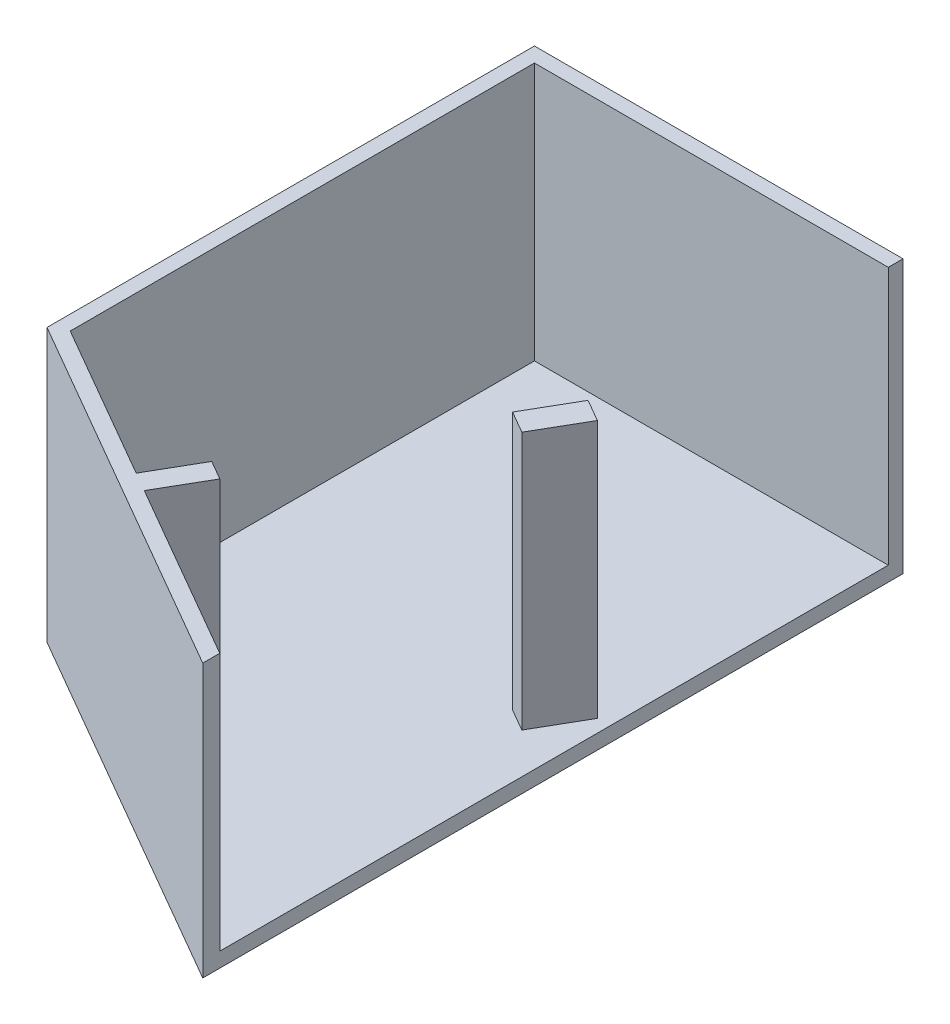
ISO-10303-21;
HEADER;
FILE_DESCRIPTION(('STEP AP214'),'2;1');
FILE_NAME('part.step','',(''),(''),'','','');
FILE_SCHEMA(('AUTOMOTIVE_DESIGN { 1 0 10303 214 1 1 1 1 }'));
ENDSEC;
DATA;
#1=APPLICATION_CONTEXT('core data for automotive mechanical design processes');
#2=APPLICATION_PROTOCOL_DEFINITION('international standard','automotive_design',2000,#1);
#3=PRODUCT_CONTEXT('',#1,'mechanical');
#4=PRODUCT('Part','Part','',(#3));
#5=PRODUCT_RELATED_PRODUCT_CATEGORY('part','',(#4));
#6=PRODUCT_DEFINITION_FORMATION('','',#4);
#7=PRODUCT_DEFINITION_CONTEXT('part definition',#1,'design');
#8=PRODUCT_DEFINITION('design','',#6,#7);
#9=PRODUCT_DEFINITION_SHAPE('','',#8);
#10=(LENGTH_UNIT() NAMED_UNIT(*) SI_UNIT(.MILLI.,.METRE.));
#11=(NAMED_UNIT(*) PLANE_ANGLE_UNIT() SI_UNIT($,.RADIAN.));
#12=(NAMED_UNIT(*) SI_UNIT($,.STERADIAN.) SOLID_ANGLE_UNIT());
#13=UNCERTAINTY_MEASURE_WITH_UNIT(LENGTH_MEASURE(1.E-05),#10,'distance_accuracy_value','');
#14=(GEOMETRIC_REPRESENTATION_CONTEXT(3) GLOBAL_UNCERTAINTY_ASSIGNED_CONTEXT((#13)) GLOBAL_UNIT_ASSIGNED_CONTEXT((#10,
#11,#12)) REPRESENTATION_CONTEXT('',''));
#15=CARTESIAN_POINT('',(0.,0.,0.));
#16=DIRECTION('',(0.,0.,1.));
#17=DIRECTION('',(1.,0.,0.));
#18=AXIS2_PLACEMENT_3D('',#15,#16,#17);
#19=CARTESIAN_POINT('',(0.,4.,0.));
#20=DIRECTION('',(0.,-1.,0.));
#21=DIRECTION('',(0.,0.,-1.));
#22=AXIS2_PLACEMENT_3D('',#19,#20,#21);
#23=PLANE('',#22);
#24=DIRECTION('',(0.499999999999999,0.,-0.866025403784439));
#25=VECTOR('',#24,1.);
#26=CARTESIAN_POINT('',(51.5358983848623,4.,157.400435732949));
#27=LINE('',#26,#25);
#28=CARTESIAN_POINT('',(51.5358983848622,4.,157.400435732949));
#29=VERTEX_POINT('',#28);
#30=CARTESIAN_POINT('',(59.0358983848623,4.,144.410054676183));
#31=VERTEX_POINT('',#30);
#32=EDGE_CURVE('E169',#29,#31,#27,.T.);
#33=ORIENTED_EDGE('',*,*,#32,.F.);
#34=DIRECTION('',(0.866025403784436,0.,0.500000000000004));
#35=VECTOR('',#34,1.);
#36=CARTESIAN_POINT('',(-55.2724133595217,4.,95.7346281956393));
#37=LINE('',#36,#35);
#38=CARTESIAN_POINT('',(100.,4.,185.381197846483));
#39=VERTEX_POINT('',#38);
#40=EDGE_CURVE('E205',#29,#39,#37,.T.);
#41=ORIENTED_EDGE('',*,*,#40,.T.);
#42=DIRECTION('',(0.,0.,-1.));
#43=VECTOR('',#42,1.);
#44=CARTESIAN_POINT('',(100.,4.,0.));
#45=LINE('',#44,#43);
#46=CARTESIAN_POINT('',(100.,4.,4.));
#47=VERTEX_POINT('',#46);
#48=EDGE_CURVE('E218',#39,#47,#45,.T.);
#49=ORIENTED_EDGE('',*,*,#48,.T.);
#50=DIRECTION('',(-1.,0.,0.));
#51=VECTOR('',#50,1.);
#52=CARTESIAN_POINT('',(0.,4.,4.));
#53=LINE('',#52,#51);
#54=CARTESIAN_POINT('',(4.,4.,4.));
#55=VERTEX_POINT('',#54);
#56=EDGE_CURVE('E219',#47,#55,#53,.T.);
#57=ORIENTED_EDGE('',*,*,#56,.T.);
#58=DIRECTION('',(0.,0.,1.));
#59=VECTOR('',#58,1.);
#60=CARTESIAN_POINT('',(4.,4.,0.));
#61=LINE('',#60,#59);
#62=CARTESIAN_POINT('',(4.,4.,129.955572004278));
#63=VERTEX_POINT('',#62);
#64=EDGE_CURVE('E202',#55,#63,#61,.T.);
#65=ORIENTED_EDGE('',*,*,#64,.T.);
#66=CARTESIAN_POINT('',(46.3397459621556,4.,154.400435732949));
#67=VERTEX_POINT('',#66);
#68=EDGE_CURVE('E216',#63,#67,#37,.T.);
#69=ORIENTED_EDGE('',*,*,#68,.T.);
#70=DIRECTION('',(-0.5,0.,0.866025403784439));
#71=VECTOR('',#70,1.);
#72=CARTESIAN_POINT('',(53.8397459621556,4.,141.410054676183));
#73=LINE('',#72,#71);
#74=CARTESIAN_POINT('',(53.8397459621556,4.,141.410054676183));
#75=VERTEX_POINT('',#74);
#76=EDGE_CURVE('E181',#75,#67,#73,.T.);
#77=ORIENTED_EDGE('',*,*,#76,.F.);
#78=DIRECTION('',(-0.866025403784436,0.,-0.500000000000004));
#79=VECTOR('',#78,1.);
#80=CARTESIAN_POINT('',(59.0358983848623,4.,144.410054676183));
#81=LINE('',#80,#79);
#82=EDGE_CURVE('E172',#31,#75,#81,.T.);
#83=ORIENTED_EDGE('',*,*,#82,.F.);
#84=EDGE_LOOP('',(#33,#41,#49,#57,#65,#69,#77,#83));
#85=FACE_BOUND('',#84,.T.);
#86=DIRECTION('',(-0.866025403784438,0.,-0.500000000000001));
#87=VECTOR('',#86,1.);
#88=CARTESIAN_POINT('',(90.5358983848623,4.,75.994047777212));
#89=LINE('',#88,#87);
#90=CARTESIAN_POINT('',(96.5358983848623,4.,79.4581493923497));
#91=VERTEX_POINT('',#90);
#92=CARTESIAN_POINT('',(90.5358983848623,4.,75.994047777212));
#93=VERTEX_POINT('',#92);
#94=EDGE_CURVE('E168',#91,#93,#89,.T.);
#95=ORIENTED_EDGE('',*,*,#94,.F.);
#96=DIRECTION('',(0.499999999999999,0.,-0.866025403784439));
#97=VECTOR('',#96,1.);
#98=CARTESIAN_POINT('',(96.5358983848623,4.,79.4581493923497));
#99=LINE('',#98,#97);
#100=CARTESIAN_POINT('',(89.0358983848623,4.,92.4485304491163));
#101=VERTEX_POINT('',#100);
#102=EDGE_CURVE('E165',#101,#91,#99,.T.);
#103=ORIENTED_EDGE('',*,*,#102,.F.);
#104=DIRECTION('',(0.866025403784439,0.,0.5));
#105=VECTOR('',#104,1.);
#106=CARTESIAN_POINT('',(89.0358983848623,4.,92.4485304491163));
#107=LINE('',#106,#105);
#108=CARTESIAN_POINT('',(83.0358983848623,4.,88.9844288339785));
#109=VERTEX_POINT('',#108);
#110=EDGE_CURVE('E55',#109,#101,#107,.T.);
#111=ORIENTED_EDGE('',*,*,#110,.F.);
#112=DIRECTION('',(-0.5,0.,0.866025403784439));
#113=VECTOR('',#112,1.);
#114=CARTESIAN_POINT('',(83.0358983848623,4.,88.9844288339786));
#115=LINE('',#114,#113);
#116=EDGE_CURVE('E50',#93,#109,#115,.T.);
#117=ORIENTED_EDGE('',*,*,#116,.F.);
#118=EDGE_LOOP('',(#95,#103,#111,#117));
#119=FACE_BOUND('',#118,.T.);
#120=ADVANCED_FACE('F35',(#85,#119),#23,.F.);
#121=CARTESIAN_POINT('',(102.,74.,186.535898384862));
#122=DIRECTION('',(0.500000000000004,0.,-0.866025403784436));
#123=DIRECTION('',(-0.866025403784436,0.,-0.500000000000004));
#124=AXIS2_PLACEMENT_3D('',#121,#122,#123);
#125=PLANE('',#124);
#126=ORIENTED_EDGE('',*,*,#40,.F.);
#127=DIRECTION('',(0.,-1.,0.));
#128=VECTOR('',#127,1.);
#129=CARTESIAN_POINT('',(51.5358983848623,74.,157.400435732949));
#130=LINE('',#129,#128);
#131=CARTESIAN_POINT('',(51.5358983848619,74.,157.400435732949));
#132=VERTEX_POINT('',#131);
#133=EDGE_CURVE('E199',#132,#29,#130,.T.);
#134=ORIENTED_EDGE('',*,*,#133,.F.);
#135=DIRECTION('',(0.866025403784436,0.,0.500000000000004));
#136=VECTOR('',#135,1.);
#137=CARTESIAN_POINT('',(-55.2724133595217,74.,95.7346281956393));
#138=LINE('',#137,#136);
#139=CARTESIAN_POINT('',(100.,74.,185.381197846483));
#140=VERTEX_POINT('',#139);
#141=EDGE_CURVE('E223',#132,#140,#138,.T.);
#142=ORIENTED_EDGE('',*,*,#141,.T.);
#143=DIRECTION('',(0.,-1.,0.));
#144=VECTOR('',#143,1.);
#145=CARTESIAN_POINT('',(100.,74.,185.381197846483));
#146=LINE('',#145,#144);
#147=EDGE_CURVE('E210',#140,#39,#146,.T.);
#148=ORIENTED_EDGE('',*,*,#147,.T.);
#149=EDGE_LOOP('',(#126,#134,#142,#148));
#150=FACE_BOUND('',#149,.T.);
#151=ADVANCED_FACE('F291',(#150),#125,.T.);
#152=CARTESIAN_POINT('',(4.,74.,129.955572004278));
#153=VERTEX_POINT('',#152);
#154=CARTESIAN_POINT('',(46.3397459621557,74.,154.400435732949));
#155=VERTEX_POINT('',#154);
#156=EDGE_CURVE('E224',#153,#155,#138,.T.);
#157=ORIENTED_EDGE('',*,*,#156,.T.);
#158=DIRECTION('',(0.,-1.,0.));
#159=VECTOR('',#158,1.);
#160=CARTESIAN_POINT('',(46.3397459621556,74.,154.400435732949));
#161=LINE('',#160,#159);
#162=EDGE_CURVE('E185',#155,#67,#161,.T.);
#163=ORIENTED_EDGE('',*,*,#162,.T.);
#164=ORIENTED_EDGE('',*,*,#68,.F.);
#165=DIRECTION('',(0.,-1.,0.));
#166=VECTOR('',#165,1.);
#167=CARTESIAN_POINT('',(4.,74.,129.955572004278));
#168=LINE('',#167,#166);
#169=EDGE_CURVE('E206',#153,#63,#168,.T.);
#170=ORIENTED_EDGE('',*,*,#169,.F.);
#171=EDGE_LOOP('',(#157,#163,#164,#170));
#172=FACE_BOUND('',#171,.T.);
#173=ADVANCED_FACE('F306',(#172),#125,.T.);
#174=CARTESIAN_POINT('',(0.,74.,0.));
#175=DIRECTION('',(0.,-1.,0.));
#176=DIRECTION('',(0.,0.,-1.));
#177=AXIS2_PLACEMENT_3D('',#174,#175,#176);
#178=PLANE('',#177);
#179=ORIENTED_EDGE('',*,*,#156,.F.);
#180=DIRECTION('',(0.,0.,1.));
#181=VECTOR('',#180,1.);
#182=CARTESIAN_POINT('',(4.,74.,0.));
#183=LINE('',#182,#181);
#184=CARTESIAN_POINT('',(4.,74.,4.));
#185=VERTEX_POINT('',#184);
#186=EDGE_CURVE('E221',#185,#153,#183,.T.);
#187=ORIENTED_EDGE('',*,*,#186,.F.);
#188=DIRECTION('',(-1.,0.,0.));
#189=VECTOR('',#188,1.);
#190=CARTESIAN_POINT('',(0.,74.,4.));
#191=LINE('',#190,#189);
#192=CARTESIAN_POINT('',(100.,74.,4.));
#193=VERTEX_POINT('',#192);
#194=EDGE_CURVE('E215',#193,#185,#191,.T.);
#195=ORIENTED_EDGE('',*,*,#194,.F.);
#196=DIRECTION('',(0.,0.,-1.));
#197=VECTOR('',#196,1.);
#198=CARTESIAN_POINT('',(100.,74.,0.));
#199=LINE('',#198,#197);
#200=CARTESIAN_POINT('',(100.,74.,0.));
#201=VERTEX_POINT('',#200);
#202=EDGE_CURVE('E238',#193,#201,#199,.T.);
#203=ORIENTED_EDGE('',*,*,#202,.T.);
#204=DIRECTION('',(-1.,0.,0.));
#205=VECTOR('',#204,1.);
#206=CARTESIAN_POINT('',(0.,74.,0.));
#207=LINE('',#206,#205);
#208=CARTESIAN_POINT('',(0.,74.,0.));
#209=VERTEX_POINT('',#208);
#210=EDGE_CURVE('E242',#201,#209,#207,.T.);
#211=ORIENTED_EDGE('',*,*,#210,.T.);
#212=DIRECTION('',(0.,0.,1.));
#213=VECTOR('',#212,1.);
#214=CARTESIAN_POINT('',(0.,74.,132.264973081037));
#215=LINE('',#214,#213);
#216=CARTESIAN_POINT('',(0.,74.,132.264973081037));
#217=VERTEX_POINT('',#216);
#218=EDGE_CURVE('E232',#209,#217,#215,.T.);
#219=ORIENTED_EDGE('',*,*,#218,.T.);
#220=DIRECTION('',(0.866025403784436,0.,0.500000000000004));
#221=VECTOR('',#220,1.);
#222=CARTESIAN_POINT('',(100.,74.,190.));
#223=LINE('',#222,#221);
#224=CARTESIAN_POINT('',(100.,74.,190.));
#225=VERTEX_POINT('',#224);
#226=EDGE_CURVE('E235',#217,#225,#223,.T.);
#227=ORIENTED_EDGE('',*,*,#226,.T.);
#228=EDGE_CURVE('E239',#225,#140,#199,.T.);
#229=ORIENTED_EDGE('',*,*,#228,.T.);
#230=ORIENTED_EDGE('',*,*,#141,.F.);
#231=DIRECTION('',(0.499999999999999,0.,-0.866025403784439));
#232=VECTOR('',#231,1.);
#233=CARTESIAN_POINT('',(51.5358983848623,74.,157.400435732949));
#234=LINE('',#233,#232);
#235=CARTESIAN_POINT('',(59.0358983848623,74.,144.410054676183));
#236=VERTEX_POINT('',#235);
#237=EDGE_CURVE('E178',#132,#236,#234,.T.);
#238=ORIENTED_EDGE('',*,*,#237,.T.);
#239=DIRECTION('',(-0.866025403784436,0.,-0.500000000000004));
#240=VECTOR('',#239,1.);
#241=CARTESIAN_POINT('',(59.0358983848623,74.,144.410054676183));
#242=LINE('',#241,#240);
#243=CARTESIAN_POINT('',(53.8397459621556,74.,141.410054676183));
#244=VERTEX_POINT('',#243);
#245=EDGE_CURVE('E180',#236,#244,#242,.T.);
#246=ORIENTED_EDGE('',*,*,#245,.T.);
#247=DIRECTION('',(-0.5,0.,0.866025403784439));
#248=VECTOR('',#247,1.);
#249=CARTESIAN_POINT('',(53.8397459621556,74.,141.410054676183));
#250=LINE('',#249,#248);
#251=EDGE_CURVE('E183',#244,#155,#250,.T.);
#252=ORIENTED_EDGE('',*,*,#251,.T.);
#253=EDGE_LOOP('',(#179,#187,#195,#203,#211,#219,#227,#229,#230,#238,#246,#252));
#254=FACE_BOUND('',#253,.T.);
#255=ADVANCED_FACE('F279',(#254),#178,.F.);
#256=CARTESIAN_POINT('',(0.,74.,132.264973081037));
#257=DIRECTION('',(1.,0.,0.));
#258=DIRECTION('',(0.,0.,-1.));
#259=AXIS2_PLACEMENT_3D('',#256,#257,#258);
#260=PLANE('',#259);
#261=DIRECTION('',(0.,0.,1.));
#262=VECTOR('',#261,1.);
#263=CARTESIAN_POINT('',(0.,0.,132.264973081037));
#264=LINE('',#263,#262);
#265=CARTESIAN_POINT('',(0.,0.,0.));
#266=VERTEX_POINT('',#265);
#267=CARTESIAN_POINT('',(0.,0.,132.264973081037));
#268=VERTEX_POINT('',#267);
#269=EDGE_CURVE('E209',#266,#268,#264,.T.);
#270=ORIENTED_EDGE('',*,*,#269,.T.);
#271=DIRECTION('',(0.,-1.,0.));
#272=VECTOR('',#271,1.);
#273=CARTESIAN_POINT('',(0.,74.,132.264973081037));
#274=LINE('',#273,#272);
#275=EDGE_CURVE('E11',#217,#268,#274,.T.);
#276=ORIENTED_EDGE('',*,*,#275,.F.);
#277=ORIENTED_EDGE('',*,*,#218,.F.);
#278=DIRECTION('',(0.,-1.,0.));
#279=VECTOR('',#278,1.);
#280=CARTESIAN_POINT('',(0.,74.,0.));
#281=LINE('',#280,#279);
#282=EDGE_CURVE('E244',#209,#266,#281,.T.);
#283=ORIENTED_EDGE('',*,*,#282,.T.);
#284=EDGE_LOOP('',(#270,#276,#277,#283));
#285=FACE_BOUND('',#284,.T.);
#286=ADVANCED_FACE('F37',(#285),#260,.F.);
#287=CARTESIAN_POINT('',(100.,74.,190.));
#288=DIRECTION('',(0.500000000000004,0.,-0.866025403784436));
#289=DIRECTION('',(-0.866025403784436,0.,-0.500000000000004));
#290=AXIS2_PLACEMENT_3D('',#287,#288,#289);
#291=PLANE('',#290);
#292=DIRECTION('',(0.866025403784436,0.,0.500000000000004));
#293=VECTOR('',#292,1.);
#294=CARTESIAN_POINT('',(100.,0.,190.));
#295=LINE('',#294,#293);
#296=CARTESIAN_POINT('',(100.,0.,190.));
#297=VERTEX_POINT('',#296);
#298=EDGE_CURVE('E247',#268,#297,#295,.T.);
#299=ORIENTED_EDGE('',*,*,#298,.T.);
#300=DIRECTION('',(0.,-1.,0.));
#301=VECTOR('',#300,1.);
#302=CARTESIAN_POINT('',(100.,74.,190.));
#303=LINE('',#302,#301);
#304=EDGE_CURVE('E43',#225,#297,#303,.T.);
#305=ORIENTED_EDGE('',*,*,#304,.F.);
#306=ORIENTED_EDGE('',*,*,#226,.F.);
#307=ORIENTED_EDGE('',*,*,#275,.T.);
#308=EDGE_LOOP('',(#299,#305,#306,#307));
#309=FACE_BOUND('',#308,.T.);
#310=ADVANCED_FACE('F331',(#309),#291,.F.);
#311=CARTESIAN_POINT('',(100.,74.,0.));
#312=DIRECTION('',(-1.,0.,0.));
#313=DIRECTION('',(0.,0.,1.));
#314=AXIS2_PLACEMENT_3D('',#311,#312,#313);
#315=PLANE('',#314);
#316=ORIENTED_EDGE('',*,*,#202,.F.);
#317=DIRECTION('',(0.,-1.,0.));
#318=VECTOR('',#317,1.);
#319=CARTESIAN_POINT('',(100.,74.,4.));
#320=LINE('',#319,#318);
#321=EDGE_CURVE('E214',#193,#47,#320,.T.);
#322=ORIENTED_EDGE('',*,*,#321,.T.);
#323=ORIENTED_EDGE('',*,*,#48,.F.);
#324=ORIENTED_EDGE('',*,*,#147,.F.);
#325=ORIENTED_EDGE('',*,*,#228,.F.);
#326=ORIENTED_EDGE('',*,*,#304,.T.);
#327=DIRECTION('',(0.,0.,-1.));
#328=VECTOR('',#327,1.);
#329=CARTESIAN_POINT('',(100.,0.,0.));
#330=LINE('',#329,#328);
#331=CARTESIAN_POINT('',(100.,0.,0.));
#332=VERTEX_POINT('',#331);
#333=EDGE_CURVE('E249',#297,#332,#330,.T.);
#334=ORIENTED_EDGE('',*,*,#333,.T.);
#335=DIRECTION('',(0.,-1.,0.));
#336=VECTOR('',#335,1.);
#337=CARTESIAN_POINT('',(100.,74.,0.));
#338=LINE('',#337,#336);
#339=EDGE_CURVE('E254',#201,#332,#338,.T.);
#340=ORIENTED_EDGE('',*,*,#339,.F.);
#341=EDGE_LOOP('',(#316,#322,#323,#324,#325,#326,#334,#340));
#342=FACE_BOUND('',#341,.T.);
#343=ADVANCED_FACE('F262',(#342),#315,.F.);
#344=CARTESIAN_POINT('',(0.,74.,0.));
#345=DIRECTION('',(0.,0.,1.));
#346=DIRECTION('',(1.,0.,0.));
#347=AXIS2_PLACEMENT_3D('',#344,#345,#346);
#348=PLANE('',#347);
#349=DIRECTION('',(-1.,0.,0.));
#350=VECTOR('',#349,1.);
#351=CARTESIAN_POINT('',(0.,0.,0.));
#352=LINE('',#351,#350);
#353=EDGE_CURVE('E236',#332,#266,#352,.T.);
#354=ORIENTED_EDGE('',*,*,#353,.T.);
#355=ORIENTED_EDGE('',*,*,#282,.F.);
#356=ORIENTED_EDGE('',*,*,#210,.F.);
#357=ORIENTED_EDGE('',*,*,#339,.T.);
#358=EDGE_LOOP('',(#354,#355,#356,#357));
#359=FACE_BOUND('',#358,.T.);
#360=ADVANCED_FACE('F272',(#359),#348,.F.);
#361=CARTESIAN_POINT('',(0.,0.,0.));
#362=DIRECTION('',(0.,-1.,0.));
#363=DIRECTION('',(0.,0.,-1.));
#364=AXIS2_PLACEMENT_3D('',#361,#362,#363);
#365=PLANE('',#364);
#366=ORIENTED_EDGE('',*,*,#269,.F.);
#367=ORIENTED_EDGE('',*,*,#353,.F.);
#368=ORIENTED_EDGE('',*,*,#333,.F.);
#369=ORIENTED_EDGE('',*,*,#298,.F.);
#370=EDGE_LOOP('',(#366,#367,#368,#369));
#371=FACE_BOUND('',#370,.T.);
#372=ADVANCED_FACE('F269',(#371),#365,.T.);
#373=CARTESIAN_POINT('',(4.,74.,132.264973081037));
#374=DIRECTION('',(1.,0.,0.));
#375=DIRECTION('',(0.,0.,-1.));
#376=AXIS2_PLACEMENT_3D('',#373,#374,#375);
#377=PLANE('',#376);
#378=ORIENTED_EDGE('',*,*,#64,.F.);
#379=DIRECTION('',(0.,-1.,0.));
#380=VECTOR('',#379,1.);
#381=CARTESIAN_POINT('',(4.,74.,4.));
#382=LINE('',#381,#380);
#383=EDGE_CURVE('E211',#185,#55,#382,.T.);
#384=ORIENTED_EDGE('',*,*,#383,.F.);
#385=ORIENTED_EDGE('',*,*,#186,.T.);
#386=ORIENTED_EDGE('',*,*,#169,.T.);
#387=EDGE_LOOP('',(#378,#384,#385,#386));
#388=FACE_BOUND('',#387,.T.);
#389=ADVANCED_FACE('F309',(#388),#377,.T.);
#390=CARTESIAN_POINT('',(0.,74.,4.));
#391=DIRECTION('',(0.,0.,1.));
#392=DIRECTION('',(1.,0.,0.));
#393=AXIS2_PLACEMENT_3D('',#390,#391,#392);
#394=PLANE('',#393);
#395=ORIENTED_EDGE('',*,*,#56,.F.);
#396=ORIENTED_EDGE('',*,*,#321,.F.);
#397=ORIENTED_EDGE('',*,*,#194,.T.);
#398=ORIENTED_EDGE('',*,*,#383,.T.);
#399=EDGE_LOOP('',(#395,#396,#397,#398));
#400=FACE_BOUND('',#399,.T.);
#401=ADVANCED_FACE('F285',(#400),#394,.T.);
#402=CARTESIAN_POINT('',(51.5358983848623,74.,157.400435732949));
#403=DIRECTION('',(-0.866025403784439,0.,-0.499999999999999));
#404=DIRECTION('',(-0.499999999999999,0.,0.866025403784439));
#405=AXIS2_PLACEMENT_3D('',#402,#403,#404);
#406=PLANE('',#405);
#407=ORIENTED_EDGE('',*,*,#32,.T.);
#408=DIRECTION('',(0.,-1.,0.));
#409=VECTOR('',#408,1.);
#410=CARTESIAN_POINT('',(59.0358983848623,74.,144.410054676183));
#411=LINE('',#410,#409);
#412=EDGE_CURVE('E196',#236,#31,#411,.T.);
#413=ORIENTED_EDGE('',*,*,#412,.F.);
#414=ORIENTED_EDGE('',*,*,#237,.F.);
#415=ORIENTED_EDGE('',*,*,#133,.T.);
#416=EDGE_LOOP('',(#407,#413,#414,#415));
#417=FACE_BOUND('',#416,.T.);
#418=ADVANCED_FACE('F296',(#417),#406,.F.);
#419=CARTESIAN_POINT('',(59.0358983848623,74.,144.410054676183));
#420=DIRECTION('',(-0.500000000000005,0.,0.866025403784436));
#421=DIRECTION('',(0.866025403784436,0.,0.500000000000005));
#422=AXIS2_PLACEMENT_3D('',#419,#420,#421);
#423=PLANE('',#422);
#424=ORIENTED_EDGE('',*,*,#82,.T.);
#425=DIRECTION('',(0.,-1.,0.));
#426=VECTOR('',#425,1.);
#427=CARTESIAN_POINT('',(53.8397459621556,74.,141.410054676183));
#428=LINE('',#427,#426);
#429=EDGE_CURVE('E193',#244,#75,#428,.T.);
#430=ORIENTED_EDGE('',*,*,#429,.F.);
#431=ORIENTED_EDGE('',*,*,#245,.F.);
#432=ORIENTED_EDGE('',*,*,#412,.T.);
#433=EDGE_LOOP('',(#424,#430,#431,#432));
#434=FACE_BOUND('',#433,.T.);
#435=ADVANCED_FACE('F300',(#434),#423,.F.);
#436=CARTESIAN_POINT('',(53.8397459621556,74.,141.410054676183));
#437=DIRECTION('',(0.866025403784439,0.,0.5));
#438=DIRECTION('',(0.5,0.,-0.866025403784439));
#439=AXIS2_PLACEMENT_3D('',#436,#437,#438);
#440=PLANE('',#439);
#441=ORIENTED_EDGE('',*,*,#76,.T.);
#442=ORIENTED_EDGE('',*,*,#162,.F.);
#443=ORIENTED_EDGE('',*,*,#251,.F.);
#444=ORIENTED_EDGE('',*,*,#429,.T.);
#445=EDGE_LOOP('',(#441,#442,#443,#444));
#446=FACE_BOUND('',#445,.T.);
#447=ADVANCED_FACE('F304',(#446),#440,.F.);
#448=CARTESIAN_POINT('',(90.5358983848623,74.,75.994047777212));
#449=DIRECTION('',(-0.500000000000001,0.,0.866025403784438));
#450=DIRECTION('',(0.866025403784438,0.,0.500000000000001));
#451=AXIS2_PLACEMENT_3D('',#448,#449,#450);
#452=PLANE('',#451);
#453=ORIENTED_EDGE('',*,*,#94,.T.);
#454=DIRECTION('',(0.,-1.,0.));
#455=VECTOR('',#454,1.);
#456=CARTESIAN_POINT('',(90.5358983848623,74.,75.994047777212));
#457=LINE('',#456,#455);
#458=CARTESIAN_POINT('',(90.5358983848623,74.,75.994047777212));
#459=VERTEX_POINT('',#458);
#460=EDGE_CURVE('E149',#459,#93,#457,.T.);
#461=ORIENTED_EDGE('',*,*,#460,.F.);
#462=DIRECTION('',(-0.866025403784438,0.,-0.500000000000001));
#463=VECTOR('',#462,1.);
#464=CARTESIAN_POINT('',(90.5358983848623,74.,75.994047777212));
#465=LINE('',#464,#463);
#466=CARTESIAN_POINT('',(96.5358983848623,74.,79.4581493923497));
#467=VERTEX_POINT('',#466);
#468=EDGE_CURVE('E156',#467,#459,#465,.T.);
#469=ORIENTED_EDGE('',*,*,#468,.F.);
#470=DIRECTION('',(0.,-1.,0.));
#471=VECTOR('',#470,1.);
#472=CARTESIAN_POINT('',(96.5358983848623,74.,79.4581493923497));
#473=LINE('',#472,#471);
#474=EDGE_CURVE('E467',#467,#91,#473,.T.);
#475=ORIENTED_EDGE('',*,*,#474,.T.);
#476=EDGE_LOOP('',(#453,#461,#469,#475));
#477=FACE_BOUND('',#476,.T.);
#478=ADVANCED_FACE('F167',(#477),#452,.F.);
#479=CARTESIAN_POINT('',(83.0358983848623,74.,88.9844288339786));
#480=DIRECTION('',(0.866025403784439,0.,0.5));
#481=DIRECTION('',(0.5,0.,-0.866025403784439));
#482=AXIS2_PLACEMENT_3D('',#479,#480,#481);
#483=PLANE('',#482);
#484=ORIENTED_EDGE('',*,*,#116,.T.);
#485=DIRECTION('',(0.,-1.,0.));
#486=VECTOR('',#485,1.);
#487=CARTESIAN_POINT('',(83.0358983848623,74.,88.9844288339786));
#488=LINE('',#487,#486);
#489=CARTESIAN_POINT('',(83.0358983848623,74.,88.9844288339786));
#490=VERTEX_POINT('',#489);
#491=EDGE_CURVE('E152',#490,#109,#488,.T.);
#492=ORIENTED_EDGE('',*,*,#491,.F.);
#493=DIRECTION('',(-0.5,0.,0.866025403784439));
#494=VECTOR('',#493,1.);
#495=CARTESIAN_POINT('',(83.0358983848623,74.,88.9844288339786));
#496=LINE('',#495,#494);
#497=EDGE_CURVE('E145',#459,#490,#496,.T.);
#498=ORIENTED_EDGE('',*,*,#497,.F.);
#499=ORIENTED_EDGE('',*,*,#460,.T.);
#500=EDGE_LOOP('',(#484,#492,#498,#499));
#501=FACE_BOUND('',#500,.T.);
#502=ADVANCED_FACE('F147',(#501),#483,.F.);
#503=CARTESIAN_POINT('',(89.0358983848623,74.,92.4485304491163));
#504=DIRECTION('',(0.5,0.,-0.866025403784439));
#505=DIRECTION('',(-0.866025403784439,0.,-0.5));
#506=AXIS2_PLACEMENT_3D('',#503,#504,#505);
#507=PLANE('',#506);
#508=ORIENTED_EDGE('',*,*,#110,.T.);
#509=DIRECTION('',(0.,-1.,0.));
#510=VECTOR('',#509,1.);
#511=CARTESIAN_POINT('',(89.0358983848623,74.,92.4485304491163));
#512=LINE('',#511,#510);
#513=CARTESIAN_POINT('',(89.0358983848623,74.,92.4485304491163));
#514=VERTEX_POINT('',#513);
#515=EDGE_CURVE('E174',#514,#101,#512,.T.);
#516=ORIENTED_EDGE('',*,*,#515,.F.);
#517=DIRECTION('',(0.866025403784439,0.,0.5));
#518=VECTOR('',#517,1.);
#519=CARTESIAN_POINT('',(89.0358983848623,74.,92.4485304491163));
#520=LINE('',#519,#518);
#521=EDGE_CURVE('E155',#490,#514,#520,.T.);
#522=ORIENTED_EDGE('',*,*,#521,.F.);
#523=ORIENTED_EDGE('',*,*,#491,.T.);
#524=EDGE_LOOP('',(#508,#516,#522,#523));
#525=FACE_BOUND('',#524,.T.);
#526=ADVANCED_FACE('F431',(#525),#507,.F.);
#527=CARTESIAN_POINT('',(96.5358983848623,74.,79.4581493923497));
#528=DIRECTION('',(-0.866025403784439,0.,-0.499999999999999));
#529=DIRECTION('',(-0.499999999999999,0.,0.866025403784439));
#530=AXIS2_PLACEMENT_3D('',#527,#528,#529);
#531=PLANE('',#530);
#532=ORIENTED_EDGE('',*,*,#102,.T.);
#533=ORIENTED_EDGE('',*,*,#474,.F.);
#534=DIRECTION('',(0.499999999999999,0.,-0.866025403784439));
#535=VECTOR('',#534,1.);
#536=CARTESIAN_POINT('',(96.5358983848623,74.,79.4581493923497));
#537=LINE('',#536,#535);
#538=EDGE_CURVE('E161',#514,#467,#537,.T.);
#539=ORIENTED_EDGE('',*,*,#538,.F.);
#540=ORIENTED_EDGE('',*,*,#515,.T.);
#541=EDGE_LOOP('',(#532,#533,#539,#540));
#542=FACE_BOUND('',#541,.T.);
#543=ADVANCED_FACE('F439',(#542),#531,.F.);
#544=CARTESIAN_POINT('',(0.,74.,0.));
#545=DIRECTION('',(0.,-1.,0.));
#546=DIRECTION('',(0.,0.,-1.));
#547=AXIS2_PLACEMENT_3D('',#544,#545,#546);
#548=PLANE('',#547);
#549=ORIENTED_EDGE('',*,*,#468,.T.);
#550=ORIENTED_EDGE('',*,*,#497,.T.);
#551=ORIENTED_EDGE('',*,*,#521,.T.);
#552=ORIENTED_EDGE('',*,*,#538,.T.);
#553=EDGE_LOOP('',(#549,#550,#551,#552));
#554=FACE_BOUND('',#553,.T.);
#555=ADVANCED_FACE('F159',(#554),#548,.F.);
#556=CLOSED_SHELL('',(#120,#151,#173,#255,#286,#310,#343,#360,#372,#389,#401,#418,#435,#447,
#478,#502,#526,#543,#555));
#557=MANIFOLD_SOLID_BREP('B2',#556);
#558=ADVANCED_BREP_SHAPE_REPRESENTATION('',(#18,#557),#14);
#559=SHAPE_DEFINITION_REPRESENTATION(#9,#558);
ENDSEC;
END-ISO-10303-21;
